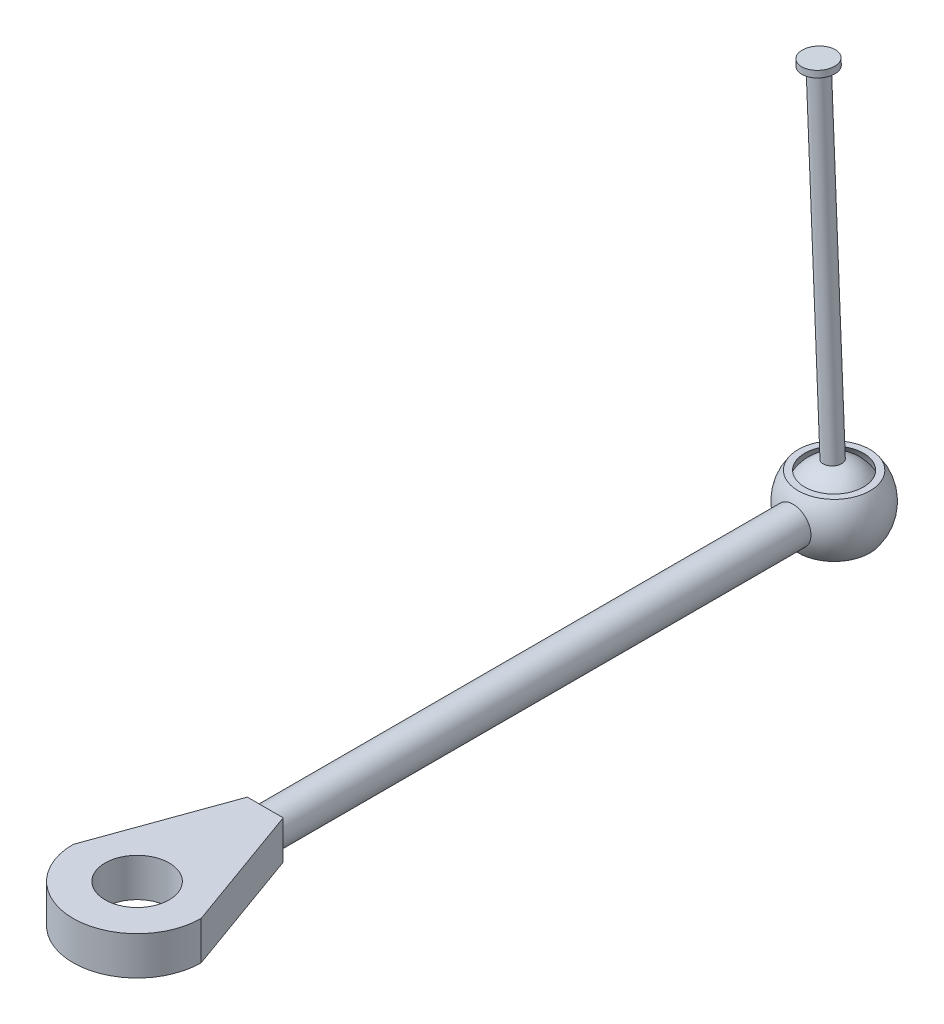
ISO-10303-21;
HEADER;
FILE_DESCRIPTION(('STEP AP214'),'2;1');
FILE_NAME('part.step','',(''),(''),'','','');
FILE_SCHEMA(('AUTOMOTIVE_DESIGN { 1 0 10303 214 1 1 1 1 }'));
ENDSEC;
DATA;
#1=APPLICATION_CONTEXT('core data for automotive mechanical design processes');
#2=APPLICATION_PROTOCOL_DEFINITION('international standard','automotive_design',2000,#1);
#3=PRODUCT_CONTEXT('',#1,'mechanical');
#4=PRODUCT('Part','Part','',(#3));
#5=PRODUCT_RELATED_PRODUCT_CATEGORY('part','',(#4));
#6=PRODUCT_DEFINITION_FORMATION('','',#4);
#7=PRODUCT_DEFINITION_CONTEXT('part definition',#1,'design');
#8=PRODUCT_DEFINITION('design','',#6,#7);
#9=PRODUCT_DEFINITION_SHAPE('','',#8);
#10=(LENGTH_UNIT() NAMED_UNIT(*) SI_UNIT(.MILLI.,.METRE.));
#11=(NAMED_UNIT(*) PLANE_ANGLE_UNIT() SI_UNIT($,.RADIAN.));
#12=(NAMED_UNIT(*) SI_UNIT($,.STERADIAN.) SOLID_ANGLE_UNIT());
#13=UNCERTAINTY_MEASURE_WITH_UNIT(LENGTH_MEASURE(1.E-05),#10,'distance_accuracy_value','');
#14=(GEOMETRIC_REPRESENTATION_CONTEXT(3) GLOBAL_UNCERTAINTY_ASSIGNED_CONTEXT((#13)) GLOBAL_UNIT_ASSIGNED_CONTEXT((#10,
#11,#12)) REPRESENTATION_CONTEXT('',''));
#15=CARTESIAN_POINT('',(0.,0.,0.));
#16=DIRECTION('',(0.,0.,1.));
#17=DIRECTION('',(1.,0.,0.));
#18=AXIS2_PLACEMENT_3D('',#15,#16,#17);
#19=CARTESIAN_POINT('',(-2.292,-2.1,0.));
#20=DIRECTION('',(0.,1.,0.));
#21=DIRECTION('',(0.,0.,1.));
#22=AXIS2_PLACEMENT_3D('',#19,#20,#21);
#23=PLANE('',#22);
#24=CARTESIAN_POINT('',(0.,-2.1,0.));
#25=DIRECTION('',(0.,1.,0.));
#26=DIRECTION('',(0.,0.,1.));
#27=AXIS2_PLACEMENT_3D('',#24,#25,#26);
#28=CIRCLE('',#27,2.8);
#29=CARTESIAN_POINT('',(0.,-2.1,2.8));
#30=VERTEX_POINT('',#29);
#31=EDGE_CURVE('P0_E34',#30,#30,#28,.T.);
#32=ORIENTED_EDGE('',*,*,#31,.F.);
#33=EDGE_LOOP('',(#32));
#34=FACE_BOUND('',#33,.T.);
#35=CARTESIAN_POINT('',(0.,-2.1,0.));
#36=DIRECTION('',(0.,1.,0.));
#37=DIRECTION('',(0.,0.,1.));
#38=AXIS2_PLACEMENT_3D('',#35,#36,#37);
#39=CIRCLE('',#38,2.292);
#40=CARTESIAN_POINT('',(0.,-2.1,2.292));
#41=VERTEX_POINT('',#40);
#42=EDGE_CURVE('P0_E21',#41,#41,#39,.T.);
#43=ORIENTED_EDGE('',*,*,#42,.T.);
#44=EDGE_LOOP('',(#43));
#45=FACE_BOUND('',#44,.T.);
#46=ADVANCED_FACE('P0_F15',(#34,#45),#23,.F.);
#47=CARTESIAN_POINT('',(0.,0.,0.));
#48=DIRECTION('',(0.,1.,0.));
#49=DIRECTION('',(0.,0.,1.));
#50=AXIS2_PLACEMENT_3D('',#47,#48,#49);
#51=DEGENERATE_TOROIDAL_SURFACE('',#50,0.508,3.5,.F.);
#52=ORIENTED_EDGE('',*,*,#42,.F.);
#53=EDGE_LOOP('',(#52));
#54=FACE_BOUND('',#53,.T.);
#55=CARTESIAN_POINT('',(0.,2.1,0.));
#56=DIRECTION('',(0.,1.,0.));
#57=DIRECTION('',(0.,0.,1.));
#58=AXIS2_PLACEMENT_3D('',#55,#56,#57);
#59=CIRCLE('',#58,2.292);
#60=CARTESIAN_POINT('',(0.,2.1,2.292));
#61=VERTEX_POINT('',#60);
#62=EDGE_CURVE('P0_E25',#61,#61,#59,.T.);
#63=ORIENTED_EDGE('',*,*,#62,.T.);
#64=EDGE_LOOP('',(#63));
#65=FACE_BOUND('',#64,.T.);
#66=ADVANCED_FACE('P0_F57',(#54,#65),#51,.T.);
#67=CARTESIAN_POINT('',(-2.8,2.1,0.));
#68=DIRECTION('',(0.,-1.,0.));
#69=DIRECTION('',(0.,0.,-1.));
#70=AXIS2_PLACEMENT_3D('',#67,#68,#69);
#71=PLANE('',#70);
#72=ORIENTED_EDGE('',*,*,#62,.F.);
#73=EDGE_LOOP('',(#72));
#74=FACE_BOUND('',#73,.T.);
#75=CARTESIAN_POINT('',(0.,2.1,0.));
#76=DIRECTION('',(0.,1.,0.));
#77=DIRECTION('',(0.,0.,1.));
#78=AXIS2_PLACEMENT_3D('',#75,#76,#77);
#79=CIRCLE('',#78,2.8);
#80=CARTESIAN_POINT('',(0.,2.1,2.8));
#81=VERTEX_POINT('',#80);
#82=EDGE_CURVE('P0_E29',#81,#81,#79,.T.);
#83=ORIENTED_EDGE('',*,*,#82,.T.);
#84=EDGE_LOOP('',(#83));
#85=FACE_BOUND('',#84,.T.);
#86=ADVANCED_FACE('P0_F53',(#74,#85),#71,.F.);
#87=CARTESIAN_POINT('',(0.,0.,0.));
#88=DIRECTION('',(0.,1.,0.));
#89=DIRECTION('',(-1.,0.,0.));
#90=AXIS2_PLACEMENT_3D('',#87,#88,#89);
#91=SPHERICAL_SURFACE('',#90,3.5);
#92=CARTESIAN_POINT('',(0.,0.,3.20780298646909));
#93=DIRECTION('',(0.,0.,-1.));
#94=DIRECTION('',(-1.,0.,0.));
#95=AXIS2_PLACEMENT_3D('',#92,#93,#94);
#96=CIRCLE('',#95,1.4);
#97=CARTESIAN_POINT('',(-1.4,0.,3.20780298646909));
#98=VERTEX_POINT('',#97);
#99=EDGE_CURVE('P0_E10',#98,#98,#96,.F.);
#100=ORIENTED_EDGE('',*,*,#99,.F.);
#101=EDGE_LOOP('',(#100));
#102=FACE_BOUND('',#101,.T.);
#103=ORIENTED_EDGE('',*,*,#31,.T.);
#104=EDGE_LOOP('',(#103));
#105=FACE_BOUND('',#104,.T.);
#106=ORIENTED_EDGE('',*,*,#82,.F.);
#107=EDGE_LOOP('',(#106));
#108=FACE_BOUND('',#107,.T.);
#109=ADVANCED_FACE('P0_F45',(#102,#105,#108),#91,.T.);
#110=CARTESIAN_POINT('',(0.,0.,-3.501));
#111=DIRECTION('',(0.,0.,1.));
#112=DIRECTION('',(1.,0.,0.));
#113=AXIS2_PLACEMENT_3D('',#110,#111,#112);
#114=CYLINDRICAL_SURFACE('',#113,1.4);
#115=ORIENTED_EDGE('',*,*,#99,.T.);
#116=EDGE_LOOP('',(#115));
#117=FACE_BOUND('',#116,.T.);
#118=CARTESIAN_POINT('',(0.,0.,44.4));
#119=DIRECTION('',(0.,0.,1.));
#120=DIRECTION('',(1.,0.,0.));
#121=AXIS2_PLACEMENT_3D('',#118,#119,#120);
#122=CIRCLE('',#121,1.4);
#123=CARTESIAN_POINT('',(1.4,0.,44.4));
#124=VERTEX_POINT('',#123);
#125=EDGE_CURVE('P0_E37',#124,#124,#122,.T.);
#126=ORIENTED_EDGE('',*,*,#125,.F.);
#127=EDGE_LOOP('',(#126));
#128=FACE_BOUND('',#127,.T.);
#129=ADVANCED_FACE('P0_F43',(#117,#128),#114,.T.);
#130=CARTESIAN_POINT('',(0.,0.,44.4));
#131=DIRECTION('',(0.,0.,1.));
#132=DIRECTION('',(1.,0.,0.));
#133=AXIS2_PLACEMENT_3D('',#130,#131,#132);
#134=PLANE('',#133);
#135=ORIENTED_EDGE('',*,*,#125,.T.);
#136=EDGE_LOOP('',(#135));
#137=FACE_BOUND('',#136,.T.);
#138=ADVANCED_FACE('P0_F41',(#137),#134,.T.);
#139=CLOSED_SHELL('',(#46,#66,#86,#109,#129,#138));
#140=MANIFOLD_SOLID_BREP('P0_B1',#139);
#141=CARTESIAN_POINT('',(0.,0.,0.));
#142=DIRECTION('',(-0.0552914491738899,0.998385219503145,-0.0130310830673763));
#143=DIRECTION('',(0.956943459801966,0.0492626198663518,-0.28606364506198));
#144=AXIS2_PLACEMENT_3D('',#141,#142,#143);
#145=SPHERICAL_SURFACE('',#144,2.83772600090261);
#146=CARTESIAN_POINT('',(-0.152053383785965,2.74559363546279,-0.0358359258871848));
#147=DIRECTION('',(0.0552914491738899,-0.998385219503144,0.0130310830673763));
#148=DIRECTION('',(0.28495976977548,0.0282868832069041,0.958122007808997));
#149=AXIS2_PLACEMENT_3D('',#146,#147,#148);
#150=CIRCLE('',#149,0.7);
#151=CARTESIAN_POINT('',(0.0474184550568713,2.76539445370762,0.634849479579113));
#152=VERTEX_POINT('',#151);
#153=EDGE_CURVE('P1_E10',#152,#152,#150,.F.);
#154=ORIENTED_EDGE('',*,*,#153,.F.);
#155=EDGE_LOOP('',(#154));
#156=FACE_BOUND('',#155,.T.);
#157=ADVANCED_FACE('P1_F16',(#156),#145,.T.);
#158=CARTESIAN_POINT('',(-1.57580630145586,28.4539787558396,-0.371385867420226));
#159=DIRECTION('',(0.0552914491738899,-0.998385219503144,0.0130310830673763));
#160=DIRECTION('',(0.28495976977548,0.0282868832069041,0.958122007808997));
#161=AXIS2_PLACEMENT_3D('',#158,#159,#160);
#162=CYLINDRICAL_SURFACE('',#161,0.7);
#163=CARTESIAN_POINT('',(-1.57580630145586,28.4539787558396,-0.371385867420226));
#164=DIRECTION('',(-0.0552914491738899,0.998385219503145,-0.0130310830673763));
#165=DIRECTION('',(-0.28495976977548,-0.0282868832069041,-0.958122007808997));
#166=AXIS2_PLACEMENT_3D('',#163,#164,#165);
#167=CIRCLE('',#166,0.7);
#168=CARTESIAN_POINT('',(-1.37633446261303,28.4737795740844,0.299299538046073));
#169=VERTEX_POINT('',#168);
#170=EDGE_CURVE('P1_E27',#169,#169,#167,.T.);
#171=CARTESIAN_POINT('',(-1.37633446261303,28.4737795740844,0.299299538046073));
#172=CARTESIAN_POINT('',(-1.36150370305396,28.2059838957472,0.302794849937042));
#173=CARTESIAN_POINT('',(-1.3466729434949,27.9381882174099,0.306290161828011));
#174=CARTESIAN_POINT('',(-1.31701142437678,27.4025968607354,0.313280785609949));
#175=CARTESIAN_POINT('',(-1.30218066481772,27.1348011823982,0.316776097500918));
#176=CARTESIAN_POINT('',(-1.2725191456996,26.5992098257236,0.323766721282857));
#177=CARTESIAN_POINT('',(-1.25768838614053,26.3314141473864,0.327262033173826));
#178=CARTESIAN_POINT('',(-1.22802686702241,25.7958227907119,0.334252656955764));
#179=CARTESIAN_POINT('',(-1.21319610746335,25.5280271123746,0.337747968846734));
#180=CARTESIAN_POINT('',(-1.18353458834523,24.9924357557001,0.344738592628672));
#181=CARTESIAN_POINT('',(-1.16870382878617,24.7246400773628,0.348233904519641));
#182=CARTESIAN_POINT('',(-1.13904230966804,24.1890487206883,0.355224528301579));
#183=CARTESIAN_POINT('',(-1.12421155010898,23.9212530423511,0.358719840192549));
#184=CARTESIAN_POINT('',(-1.09455003099086,23.3856616856765,0.365710463974487));
#185=CARTESIAN_POINT('',(-1.0797192714318,23.1178660073393,0.369205775865456));
#186=CARTESIAN_POINT('',(-1.05005775231367,22.5822746506648,0.376196399647394));
#187=CARTESIAN_POINT('',(-1.03522699275461,22.3144789723275,0.379691711538364));
#188=CARTESIAN_POINT('',(-1.00556547363649,21.778887615653,0.386682335320302));
#189=CARTESIAN_POINT('',(-0.990734714077429,21.5110919373157,0.390177647211271));
#190=CARTESIAN_POINT('',(-0.961073194959306,20.9755005806412,0.397168270993209));
#191=CARTESIAN_POINT('',(-0.946242435400244,20.707704902304,0.400663582884179));
#192=CARTESIAN_POINT('',(-0.916580916282122,20.1721135456294,0.407654206666117));
#193=CARTESIAN_POINT('',(-0.90175015672306,19.9043178672922,0.411149518557086));
#194=CARTESIAN_POINT('',(-0.872088637604937,19.3687265106177,0.418140142339025));
#195=CARTESIAN_POINT('',(-0.857257878045876,19.1009308322804,0.421635454229994));
#196=CARTESIAN_POINT('',(-0.827596358927753,18.5653394756059,0.428626078011932));
#197=CARTESIAN_POINT('',(-0.812765599368692,18.2975437972686,0.432121389902901));
#198=CARTESIAN_POINT('',(-0.783104080250569,17.7619524405941,0.43911201368484));
#199=CARTESIAN_POINT('',(-0.768273320691507,17.4941567622568,0.442607325575809));
#200=CARTESIAN_POINT('',(-0.738611801573384,16.9585654055823,0.449597949357747));
#201=CARTESIAN_POINT('',(-0.723781042014323,16.6907697272451,0.453093261248716));
#202=CARTESIAN_POINT('',(-0.6941195228962,16.1551783705706,0.460083885030655));
#203=CARTESIAN_POINT('',(-0.679288763337139,15.8873826922333,0.463579196921624));
#204=CARTESIAN_POINT('',(-0.649627244219016,15.3517913355588,0.470569820703562));
#205=CARTESIAN_POINT('',(-0.634796484659955,15.0839956572215,0.474065132594531));
#206=CARTESIAN_POINT('',(-0.605134965541832,14.548404300547,0.48105575637647));
#207=CARTESIAN_POINT('',(-0.59030420598277,14.2806086222097,0.484551068267439));
#208=CARTESIAN_POINT('',(-0.560642686864647,13.7450172655352,0.491541692049377));
#209=CARTESIAN_POINT('',(-0.545811927305586,13.477221587198,0.495037003940346));
#210=CARTESIAN_POINT('',(-0.516150408187463,12.9416302305235,0.502027627722285));
#211=CARTESIAN_POINT('',(-0.501319648628401,12.6738345521862,0.505522939613254));
#212=CARTESIAN_POINT('',(-0.471658129510278,12.1382431955117,0.512513563395192));
#213=CARTESIAN_POINT('',(-0.456827369951217,11.8704475171744,0.516008875286161));
#214=CARTESIAN_POINT('',(-0.427165850833094,11.3348561604999,0.5229994990681));
#215=CARTESIAN_POINT('',(-0.412335091274033,11.0670604821626,0.526494810959069));
#216=CARTESIAN_POINT('',(-0.38267357215591,10.5314691254881,0.533485434741007));
#217=CARTESIAN_POINT('',(-0.367842812596849,10.2636734471509,0.536980746631976));
#218=CARTESIAN_POINT('',(-0.338181293478726,9.72808209047634,0.543971370413915));
#219=CARTESIAN_POINT('',(-0.323350533919664,9.46028641213909,0.547466682304884));
#220=CARTESIAN_POINT('',(-0.293689014801541,8.92469505546457,0.554457306086822));
#221=CARTESIAN_POINT('',(-0.27885825524248,8.65689937712731,0.557952617977792));
#222=CARTESIAN_POINT('',(-0.249196736124357,8.12130802045279,0.56494324175973));
#223=CARTESIAN_POINT('',(-0.234365976565296,7.85351234211553,0.568438553650699));
#224=CARTESIAN_POINT('',(-0.204704457447173,7.31792098544102,0.575429177432637));
#225=CARTESIAN_POINT('',(-0.189873697888112,7.05012530710376,0.578924489323607));
#226=CARTESIAN_POINT('',(-0.160212178769989,6.51453395042924,0.585915113105545));
#227=CARTESIAN_POINT('',(-0.145381419210927,6.24673827209198,0.589410424996514));
#228=CARTESIAN_POINT('',(-0.115719900092804,5.71114691541746,0.596401048778452));
#229=CARTESIAN_POINT('',(-0.100889140533743,5.44335123708021,0.599896360669422));
#230=CARTESIAN_POINT('',(-0.07122762141562,4.90775988040569,0.60688698445136));
#231=CARTESIAN_POINT('',(-0.0563968618565585,4.63996420206843,0.610382296342329));
#232=CARTESIAN_POINT('',(-0.0267353427384357,4.10437284539391,0.617372920124267));
#233=CARTESIAN_POINT('',(-0.0119045831793744,3.83657716705665,0.620868232015237));
#234=CARTESIAN_POINT('',(0.0177569359387483,3.30098581038214,0.627858855797175));
#235=CARTESIAN_POINT('',(0.0325876954978097,3.03319013204488,0.631354167688144));
#236=CARTESIAN_POINT('',(0.0474184550568713,2.76539445370762,0.634849479579113));
#237=B_SPLINE_CURVE_WITH_KNOTS('',3,(#171,#172,#173,#174,#175,#176,#177,#178,#179,#180,#181,
#182,#183,#184,#185,#186,#187,#188,#189,#190,#191,#192,#193,#194,#195,#196,#197,#198,#199,#200,
#201,#202,#203,#204,#205,#206,#207,#208,#209,#210,#211,#212,#213,#214,#215,#216,#217,#218,#219,
#220,#221,#222,#223,#224,#225,#226,#227,#228,#229,#230,#231,#232,#233,#234,#235,#236),
.UNSPECIFIED.,.F.,.F.,(4,2,2,2,2,2,2,2,2,2,2,2,2,2,2,2,2,2,2,2,2,2,2,2,2,2,2,2,2,2,2,2,4),(0.,
0.804686426960113,1.60937285392023,2.41405928088034,3.21874570784046,4.02343213480057,
4.82811856176069,5.63280498872081,6.43749141568092,7.24217784264104,8.04686426960116,
8.85155069656127,9.65623712352139,10.4609235504815,11.2656099774416,12.0702964044017,
12.8749828313618,13.679669258322,14.4843556852821,15.2890421122422,16.0937285392023,
16.8984149661624,17.7031013931225,18.5077878200827,19.3124742470428,20.1171606740029,
20.921847100963,21.7265335279231,22.5312199548832,23.3359063818433,24.1405928088035,
24.9452792357636,25.7499656627237),.UNSPECIFIED.);
#238=EDGE_CURVE('P1_BSEAM46',#169,#152,#237,.T.);
#239=ORIENTED_EDGE('',*,*,#170,.F.);
#240=ORIENTED_EDGE('',*,*,#153,.T.);
#241=ORIENTED_EDGE('',*,*,#238,.T.);
#242=ORIENTED_EDGE('',*,*,#238,.F.);
#243=EDGE_LOOP('',(#239,#241,#240,#242));
#244=FACE_BOUND('',#243,.T.);
#245=ADVANCED_FACE('P1_F46',(#244),#162,.T.);
#246=CARTESIAN_POINT('',(-1.60345202604281,28.9531713655912,-0.377901408953914));
#247=DIRECTION('',(0.0552914491738899,-0.998385219503145,0.0130310830673763));
#248=DIRECTION('',(0.28495976977548,0.0282868832069041,0.958122007808997));
#249=AXIS2_PLACEMENT_3D('',#246,#247,#248);
#250=CYLINDRICAL_SURFACE('',#249,1.25);
#251=CARTESIAN_POINT('',(-1.60345202604281,28.9531713655912,-0.377901408953914));
#252=DIRECTION('',(-0.0552914491738899,0.998385219503145,-0.0130310830673763));
#253=DIRECTION('',(-0.28495976977548,-0.0282868832069041,-0.958122007808997));
#254=AXIS2_PLACEMENT_3D('',#251,#252,#253);
#255=CIRCLE('',#254,1.25);
#256=CARTESIAN_POINT('',(-1.24725231382346,28.9885299695998,0.819751100807333));
#257=VERTEX_POINT('',#256);
#258=EDGE_CURVE('P1_E32',#257,#257,#255,.T.);
#259=CARTESIAN_POINT('',(-1.57580630145586,28.4539787558396,-0.371385867420226));
#260=DIRECTION('',(-0.0552914491738899,0.998385219503145,-0.0130310830673763));
#261=DIRECTION('',(-0.28495976977548,-0.0282868832069041,-0.958122007808997));
#262=AXIS2_PLACEMENT_3D('',#259,#260,#261);
#263=CIRCLE('',#262,1.25);
#264=CARTESIAN_POINT('',(-1.21960658923651,28.4893373598483,0.826266642341021));
#265=VERTEX_POINT('',#264);
#266=EDGE_CURVE('P1_E35',#265,#265,#263,.T.);
#267=CARTESIAN_POINT('',(-1.24725231382346,28.9885299695998,0.819751100807333));
#268=CARTESIAN_POINT('',(-1.24696433752568,28.9833300465816,0.819818971031642));
#269=CARTESIAN_POINT('',(-1.2466763612279,28.9781301235633,0.819886841255952));
#270=CARTESIAN_POINT('',(-1.24610040863233,28.9677302775268,0.82002258170457));
#271=CARTESIAN_POINT('',(-1.24581243233455,28.9625303545086,0.820090451928879));
#272=CARTESIAN_POINT('',(-1.24523647973899,28.9521305084721,0.820226192377498));
#273=CARTESIAN_POINT('',(-1.24494850344121,28.9469305854539,0.820294062601807));
#274=CARTESIAN_POINT('',(-1.24437255084565,28.9365307394174,0.820429803050426));
#275=CARTESIAN_POINT('',(-1.24408457454787,28.9313308163991,0.820497673274735));
#276=CARTESIAN_POINT('',(-1.24350862195231,28.9209309703626,0.820633413723353));
#277=CARTESIAN_POINT('',(-1.24322064565453,28.9157310473444,0.820701283947663));
#278=CARTESIAN_POINT('',(-1.24264469305897,28.9053312013079,0.820837024396281));
#279=CARTESIAN_POINT('',(-1.24235671676119,28.9001312782896,0.82090489462059));
#280=CARTESIAN_POINT('',(-1.24178076416562,28.8897314322532,0.821040635069209));
#281=CARTESIAN_POINT('',(-1.24149278786784,28.8845315092349,0.821108505293518));
#282=CARTESIAN_POINT('',(-1.24091683527228,28.8741316631984,0.821244245742137));
#283=CARTESIAN_POINT('',(-1.2406288589745,28.8689317401802,0.821312115966446));
#284=CARTESIAN_POINT('',(-1.24005290637894,28.8585318941437,0.821447856415064));
#285=CARTESIAN_POINT('',(-1.23976493008116,28.8533319711254,0.821515726639374));
#286=CARTESIAN_POINT('',(-1.2391889774856,28.8429321250889,0.821651467087992));
#287=CARTESIAN_POINT('',(-1.23890100118782,28.8377322020707,0.821719337312301));
#288=CARTESIAN_POINT('',(-1.23832504859226,28.8273323560342,0.82185507776092));
#289=CARTESIAN_POINT('',(-1.23803707229448,28.822132433016,0.821922947985229));
#290=CARTESIAN_POINT('',(-1.23746111969891,28.8117325869795,0.822058688433848));
#291=CARTESIAN_POINT('',(-1.23717314340113,28.8065326639612,0.822126558658157));
#292=CARTESIAN_POINT('',(-1.23659719080557,28.7961328179247,0.822262299106775));
#293=CARTESIAN_POINT('',(-1.23630921450779,28.7909328949065,0.822330169331085));
#294=CARTESIAN_POINT('',(-1.23573326191223,28.78053304887,0.822465909779703));
#295=CARTESIAN_POINT('',(-1.23544528561445,28.7753331258518,0.822533780004012));
#296=CARTESIAN_POINT('',(-1.23486933301889,28.7649332798153,0.822669520452631));
#297=CARTESIAN_POINT('',(-1.23458135672111,28.759733356797,0.82273739067694));
#298=CARTESIAN_POINT('',(-1.23400540412555,28.7493335107605,0.822873131125559));
#299=CARTESIAN_POINT('',(-1.23371742782777,28.7441335877423,0.822941001349868));
#300=CARTESIAN_POINT('',(-1.2331414752322,28.7337337417058,0.823076741798486));
#301=CARTESIAN_POINT('',(-1.23285349893442,28.7285338186875,0.823144612022796));
#302=CARTESIAN_POINT('',(-1.23227754633886,28.7181339726511,0.823280352471414));
#303=CARTESIAN_POINT('',(-1.23198957004108,28.7129340496328,0.823348222695723));
#304=CARTESIAN_POINT('',(-1.23141361744552,28.7025342035963,0.823483963144342));
#305=CARTESIAN_POINT('',(-1.23112564114774,28.6973342805781,0.823551833368651));
#306=CARTESIAN_POINT('',(-1.23054968855218,28.6869344345416,0.82368757381727));
#307=CARTESIAN_POINT('',(-1.2302617122544,28.6817345115233,0.823755444041579));
#308=CARTESIAN_POINT('',(-1.22968575965884,28.6713346654868,0.823891184490197));
#309=CARTESIAN_POINT('',(-1.22939778336105,28.6661347424686,0.823959054714507));
#310=CARTESIAN_POINT('',(-1.22882183076549,28.6557348964321,0.824094795163125));
#311=CARTESIAN_POINT('',(-1.22853385446771,28.6505349734139,0.824162665387434));
#312=CARTESIAN_POINT('',(-1.22795790187215,28.6401351273774,0.824298405836053));
#313=CARTESIAN_POINT('',(-1.22766992557437,28.6349352043591,0.824366276060362));
#314=CARTESIAN_POINT('',(-1.22709397297881,28.6245353583226,0.824502016508981));
#315=CARTESIAN_POINT('',(-1.22680599668103,28.6193354353044,0.82456988673329));
#316=CARTESIAN_POINT('',(-1.22623004408547,28.6089355892679,0.824705627181908));
#317=CARTESIAN_POINT('',(-1.22594206778769,28.6037356662497,0.824773497406218));
#318=CARTESIAN_POINT('',(-1.22536611519213,28.5933358202132,0.824909237854836));
#319=CARTESIAN_POINT('',(-1.22507813889434,28.5881358971949,0.824977108079145));
#320=CARTESIAN_POINT('',(-1.22450218629878,28.5777360511584,0.825112848527764));
#321=CARTESIAN_POINT('',(-1.224214210001,28.5725361281402,0.825180718752073));
#322=CARTESIAN_POINT('',(-1.22363825740544,28.5621362821037,0.825316459200692));
#323=CARTESIAN_POINT('',(-1.22335028110766,28.5569363590854,0.825384329425001));
#324=CARTESIAN_POINT('',(-1.2227743285121,28.546536513049,0.825520069873619));
#325=CARTESIAN_POINT('',(-1.22248635221432,28.5413365900307,0.825587940097929));
#326=CARTESIAN_POINT('',(-1.22191039961876,28.5309367439942,0.825723680546547));
#327=CARTESIAN_POINT('',(-1.22162242332098,28.525736820976,0.825791550770856));
#328=CARTESIAN_POINT('',(-1.22104647072542,28.5153369749395,0.825927291219475));
#329=CARTESIAN_POINT('',(-1.22075849442763,28.5101370519212,0.825995161443784));
#330=CARTESIAN_POINT('',(-1.22018254183207,28.4997372058847,0.826130901892403));
#331=CARTESIAN_POINT('',(-1.21989456553429,28.4945372828665,0.826198772116712));
#332=CARTESIAN_POINT('',(-1.21960658923651,28.4893373598483,0.826266642341021));
#333=B_SPLINE_CURVE_WITH_KNOTS('',3,(#267,#268,#269,#270,#271,#272,#273,#274,#275,#276,#277,
#278,#279,#280,#281,#282,#283,#284,#285,#286,#287,#288,#289,#290,#291,#292,#293,#294,#295,#296,
#297,#298,#299,#300,#301,#302,#303,#304,#305,#306,#307,#308,#309,#310,#311,#312,#313,#314,#315,
#316,#317,#318,#319,#320,#321,#322,#323,#324,#325,#326,#327,#328,#329,#330,#331,#332),
.UNSPECIFIED.,.F.,.F.,(4,2,2,2,2,2,2,2,2,2,2,2,2,2,2,2,2,2,2,2,2,2,2,2,2,2,2,2,2,2,2,2,4),(0.,
0.015624999999998,0.0312499999999995,0.0468749999999975,0.062499999999999,0.078124999999997,
0.0937499999999985,0.109374999999996,0.124999999999998,0.140624999999999,0.156249999999997,
0.171874999999999,0.187499999999997,0.203124999999998,0.218749999999996,0.234374999999998,
0.249999999999999,0.265624999999997,0.281249999999999,0.296874999999997,0.312499999999998,
0.328124999999996,0.343749999999998,0.359374999999996,0.374999999999997,0.390624999999999,
0.406249999999997,0.421874999999998,0.437499999999996,0.453124999999998,0.468749999999996,
0.484374999999997,0.499999999999995),.UNSPECIFIED.);
#334=EDGE_CURVE('P1_BSEAM43',#257,#265,#333,.T.);
#335=ORIENTED_EDGE('',*,*,#258,.F.);
#336=ORIENTED_EDGE('',*,*,#266,.T.);
#337=ORIENTED_EDGE('',*,*,#334,.T.);
#338=ORIENTED_EDGE('',*,*,#334,.F.);
#339=EDGE_LOOP('',(#335,#337,#336,#338));
#340=FACE_BOUND('',#339,.T.);
#341=ADVANCED_FACE('P1_F43',(#340),#250,.T.);
#342=CARTESIAN_POINT('',(-1.60345202604281,28.9531713655912,-0.377901408953914));
#343=DIRECTION('',(-0.0552914491738899,0.998385219503145,-0.0130310830673763));
#344=DIRECTION('',(-0.28495976977548,-0.0282868832069041,-0.958122007808997));
#345=AXIS2_PLACEMENT_3D('',#342,#343,#344);
#346=PLANE('',#345);
#347=ORIENTED_EDGE('',*,*,#258,.T.);
#348=EDGE_LOOP('',(#347));
#349=FACE_BOUND('',#348,.T.);
#350=ADVANCED_FACE('P1_F41',(#349),#346,.T.);
#351=CARTESIAN_POINT('',(-1.57580630145586,28.4539787558396,-0.371385867420226));
#352=DIRECTION('',(-0.0552914491738899,0.998385219503145,-0.0130310830673763));
#353=DIRECTION('',(-0.28495976977548,-0.0282868832069041,-0.958122007808997));
#354=AXIS2_PLACEMENT_3D('',#351,#352,#353);
#355=PLANE('',#354);
#356=ORIENTED_EDGE('',*,*,#170,.T.);
#357=EDGE_LOOP('',(#356));
#358=FACE_BOUND('',#357,.T.);
#359=ORIENTED_EDGE('',*,*,#266,.F.);
#360=EDGE_LOOP('',(#359));
#361=FACE_BOUND('',#360,.T.);
#362=ADVANCED_FACE('P1_F50',(#358,#361),#355,.F.);
#363=CLOSED_SHELL('',(#157,#245,#341,#350,#362));
#364=CARTESIAN_POINT('',(0.,0.,0.));
#365=DIRECTION('',(-0.0552914491738899,0.998385219503145,-0.0130310830673763));
#366=DIRECTION('',(0.956943459801966,0.0492626198663518,-0.28606364506198));
#367=AXIS2_PLACEMENT_3D('',#364,#365,#366);
#368=SPHERICAL_SURFACE('',#367,2.80972600090261);
#369=CARTESIAN_POINT('',(-0.150455340194582,2.71673812298127,-0.0354592991375565));
#370=DIRECTION('',(0.0552914491738899,-0.998385219503144,0.0130310830673763));
#371=DIRECTION('',(0.28495976977548,0.0282868832069041,0.958122007808997));
#372=AXIS2_PLACEMENT_3D('',#369,#370,#371);
#373=CIRCLE('',#372,0.7);
#374=CARTESIAN_POINT('',(0.049016498648254,2.7365389412261,0.635226106328742));
#375=VERTEX_POINT('',#374);
#376=EDGE_CURVE('P1_E19',#375,#375,#373,.F.);
#377=ORIENTED_EDGE('',*,*,#376,.T.);
#378=EDGE_LOOP('',(#377));
#379=FACE_BOUND('',#378,.T.);
#380=ADVANCED_FACE('P1_F79',(#379),#368,.F.);
#381=CARTESIAN_POINT('',(0.,0.,0.));
#382=DIRECTION('',(-0.0552914491738899,0.998385219503145,-0.0130310830673763));
#383=DIRECTION('',(-0.28495976977548,-0.0282868832069041,-0.958122007808997));
#384=AXIS2_PLACEMENT_3D('',#381,#382,#383);
#385=PLANE('',#384);
#386=CARTESIAN_POINT('',(0.,0.,0.));
#387=DIRECTION('',(-0.0552914491738899,0.998385219503145,-0.0130310830673763));
#388=DIRECTION('',(-0.28495976977548,-0.0282868832069041,-0.958122007808997));
#389=AXIS2_PLACEMENT_3D('',#386,#387,#388);
#390=CIRCLE('',#389,0.7);
#391=CARTESIAN_POINT('',(0.199471838842836,0.0198008182448334,0.670685405466298));
#392=VERTEX_POINT('',#391);
#393=EDGE_CURVE('P1_E29',#392,#392,#390,.T.);
#394=ORIENTED_EDGE('',*,*,#393,.F.);
#395=EDGE_LOOP('',(#394));
#396=FACE_BOUND('',#395,.T.);
#397=ADVANCED_FACE('P1_F73',(#396),#385,.F.);
#398=CARTESIAN_POINT('',(0.049016498648254,2.7365389412261,0.635226106328742));
#399=CARTESIAN_POINT('',(0.0505837417752809,2.70823958577838,0.635595474028091));
#400=CARTESIAN_POINT('',(0.0521509849023078,2.67994023033066,0.635964841727441));
#401=CARTESIAN_POINT('',(0.0552854711563616,2.62334151943522,0.63670357712614));
#402=CARTESIAN_POINT('',(0.0568527142833885,2.5950421639875,0.637072944825489));
#403=CARTESIAN_POINT('',(0.0599872005374423,2.53844345309205,0.637811680224188));
#404=CARTESIAN_POINT('',(0.0615544436644693,2.51014409764433,0.638181047923538));
#405=CARTESIAN_POINT('',(0.0646889299185232,2.45354538674889,0.638919783322237));
#406=CARTESIAN_POINT('',(0.0662561730455501,2.42524603130117,0.639289151021587));
#407=CARTESIAN_POINT('',(0.0693906592996038,2.36864732040573,0.640027886420286));
#408=CARTESIAN_POINT('',(0.0709579024266305,2.340347964958,0.640397254119635));
#409=CARTESIAN_POINT('',(0.0740923886806843,2.28374925406256,0.641135989518334));
#410=CARTESIAN_POINT('',(0.0756596318077113,2.25544989861484,0.641505357217684));
#411=CARTESIAN_POINT('',(0.0787941180617652,2.1988511877194,0.642244092616383));
#412=CARTESIAN_POINT('',(0.0803613611887921,2.17055183227167,0.642613460315733));
#413=CARTESIAN_POINT('',(0.0834958474428459,2.11395312137623,0.643352195714432));
#414=CARTESIAN_POINT('',(0.0850630905698727,2.08565376592851,0.643721563413781));
#415=CARTESIAN_POINT('',(0.0881975768239265,2.02905505503306,0.64446029881248));
#416=CARTESIAN_POINT('',(0.0897648199509534,2.00075569958534,0.64482966651183));
#417=CARTESIAN_POINT('',(0.0928993062050072,1.9441569886899,0.645568401910529));
#418=CARTESIAN_POINT('',(0.0944665493320339,1.91585763324218,0.645937769609878));
#419=CARTESIAN_POINT('',(0.0976010355860877,1.85925892234674,0.646676505008578));
#420=CARTESIAN_POINT('',(0.0991682787131147,1.83095956689901,0.647045872707927));
#421=CARTESIAN_POINT('',(0.102302764967169,1.77436085600357,0.647784608106626));
#422=CARTESIAN_POINT('',(0.103870008094195,1.74606150055585,0.648153975805976));
#423=CARTESIAN_POINT('',(0.107004494348249,1.68946278966041,0.648892711204675));
#424=CARTESIAN_POINT('',(0.108571737475276,1.66116343421269,0.649262078904024));
#425=CARTESIAN_POINT('',(0.11170622372933,1.60456472331724,0.650000814302723));
#426=CARTESIAN_POINT('',(0.113273466856357,1.57626536786952,0.650370182002073));
#427=CARTESIAN_POINT('',(0.116407953110411,1.51966665697408,0.651108917400772));
#428=CARTESIAN_POINT('',(0.117975196237437,1.49136730152636,0.651478285100122));
#429=CARTESIAN_POINT('',(0.121109682491491,1.43476859063091,0.652217020498821));
#430=CARTESIAN_POINT('',(0.122676925618518,1.40646923518319,0.65258638819817));
#431=CARTESIAN_POINT('',(0.125811411872572,1.34987052428775,0.653325123596869));
#432=CARTESIAN_POINT('',(0.127378654999599,1.32157116884003,0.653694491296219));
#433=CARTESIAN_POINT('',(0.130513141253653,1.26497245794459,0.654433226694918));
#434=CARTESIAN_POINT('',(0.13208038438068,1.23667310249686,0.654802594394268));
#435=CARTESIAN_POINT('',(0.135214870634733,1.18007439160142,0.655541329792967));
#436=CARTESIAN_POINT('',(0.13678211376176,1.1517750361537,0.655910697492316));
#437=CARTESIAN_POINT('',(0.139916600015814,1.09517632525825,0.656649432891015));
#438=CARTESIAN_POINT('',(0.141483843142841,1.06687696981053,0.657018800590365));
#439=CARTESIAN_POINT('',(0.144618329396895,1.01027825891509,0.657757535989064));
#440=CARTESIAN_POINT('',(0.146185572523921,0.981978903467367,0.658126903688413));
#441=CARTESIAN_POINT('',(0.149320058777975,0.925380192571924,0.658865639087113));
#442=CARTESIAN_POINT('',(0.150887301905002,0.897080837124201,0.659235006786462));
#443=CARTESIAN_POINT('',(0.154021788159056,0.840482126228758,0.659973742185161));
#444=CARTESIAN_POINT('',(0.155589031286083,0.812182770781037,0.660343109884511));
#445=CARTESIAN_POINT('',(0.158723517540137,0.755584059885594,0.66108184528321));
#446=CARTESIAN_POINT('',(0.160290760667164,0.727284704437873,0.661451212982559));
#447=CARTESIAN_POINT('',(0.163425246921217,0.670685993542431,0.662189948381258));
#448=CARTESIAN_POINT('',(0.164992490048244,0.64238663809471,0.662559316080608));
#449=CARTESIAN_POINT('',(0.168126976302298,0.585787927199267,0.663298051479307));
#450=CARTESIAN_POINT('',(0.169694219429325,0.557488571751546,0.663667419178657));
#451=CARTESIAN_POINT('',(0.172828705683379,0.500889860856103,0.664406154577356));
#452=CARTESIAN_POINT('',(0.174395948810406,0.47259050540838,0.664775522276705));
#453=CARTESIAN_POINT('',(0.17753043506446,0.415991794512937,0.665514257675404));
#454=CARTESIAN_POINT('',(0.179097678191486,0.387692439065216,0.665883625374754));
#455=CARTESIAN_POINT('',(0.18223216444554,0.331093728169773,0.666622360773453));
#456=CARTESIAN_POINT('',(0.183799407572567,0.302794372722052,0.666991728472803));
#457=CARTESIAN_POINT('',(0.186933893826621,0.246195661826609,0.667730463871502));
#458=CARTESIAN_POINT('',(0.188501136953648,0.217896306378886,0.668099831570851));
#459=CARTESIAN_POINT('',(0.191635623207702,0.161297595483442,0.66883856696955));
#460=CARTESIAN_POINT('',(0.193202866334728,0.132998240035719,0.6692079346689));
#461=CARTESIAN_POINT('',(0.196337352588782,0.0763995291402757,0.669946670067599));
#462=CARTESIAN_POINT('',(0.197904595715809,0.0481001736925545,0.670316037766949));
#463=CARTESIAN_POINT('',(0.199471838842836,0.0198008182448334,0.670685405466298));
#464=B_SPLINE_CURVE_WITH_KNOTS('',3,(#398,#399,#400,#401,#402,#403,#404,#405,#406,#407,#408,
#409,#410,#411,#412,#413,#414,#415,#416,#417,#418,#419,#420,#421,#422,#423,#424,#425,#426,#427,
#428,#429,#430,#431,#432,#433,#434,#435,#436,#437,#438,#439,#440,#441,#442,#443,#444,#445,#446,
#447,#448,#449,#450,#451,#452,#453,#454,#455,#456,#457,#458,#459,#460,#461,#462,#463),
.UNSPECIFIED.,.F.,.F.,(4,2,2,2,2,2,2,2,2,2,2,2,2,2,2,2,2,2,2,2,2,2,2,2,2,2,2,2,2,2,2,2,4),(0.,
0.0850353798160332,0.170070759632066,0.255106139448103,0.340141519264136,0.425176899080169,
0.510212278896206,0.595247658712239,0.680283038528276,0.765318418344309,0.850353798160342,
0.935389177976378,1.02042455779241,1.10545993760844,1.19049531742448,1.27553069724051,
1.36056607705655,1.44560145687258,1.53063683668861,1.61567221650465,1.70070759632069,
1.78574297613672,1.87077835595276,1.95581373576879,2.04084911558482,2.12588449540086,
2.21091987521689,2.29595525503293,2.38099063484896,2.46602601466499,2.55106139448103,
2.63609677429707,2.7211321541131),.UNSPECIFIED.);
#465=EDGE_CURVE('P1_BSEAM67',#375,#392,#464,.T.);
#466=ORIENTED_EDGE('',*,*,#376,.F.);
#467=ORIENTED_EDGE('',*,*,#393,.T.);
#468=ORIENTED_EDGE('',*,*,#465,.T.);
#469=ORIENTED_EDGE('',*,*,#465,.F.);
#470=EDGE_LOOP('',(#466,#468,#467,#469));
#471=FACE_BOUND('',#470,.T.);
#472=ADVANCED_FACE('P1_F67',(#471),#162,.T.);
#473=CLOSED_SHELL('',(#380,#397,#472));
#474=ORIENTED_CLOSED_SHELL('',*,#473,.T.);
#475=BREP_WITH_VOIDS('P1_B1',#363,(#474));
#476=CARTESIAN_POINT('',(0.,1.5,54.4));
#477=DIRECTION('',(0.,1.,0.));
#478=DIRECTION('',(0.,0.,1.));
#479=AXIS2_PLACEMENT_3D('',#476,#477,#478);
#480=PLANE('',#479);
#481=DIRECTION('',(-0.338719468272742,0.,0.940887411868727));
#482=VECTOR('',#481,1.);
#483=CARTESIAN_POINT('',(-1.4,1.5,44.4));
#484=LINE('',#483,#482);
#485=CARTESIAN_POINT('',(-1.4,1.5,44.4));
#486=VERTEX_POINT('',#485);
#487=CARTESIAN_POINT('',(-5.,1.5,54.4));
#488=VERTEX_POINT('',#487);
#489=EDGE_CURVE('P2_E68',#486,#488,#484,.T.);
#490=ORIENTED_EDGE('',*,*,#489,.T.);
#491=CARTESIAN_POINT('',(0.,1.5,54.4));
#492=DIRECTION('',(0.,1.,0.));
#493=DIRECTION('',(0.,0.,1.));
#494=AXIS2_PLACEMENT_3D('',#491,#492,#493);
#495=CIRCLE('',#494,5.);
#496=CARTESIAN_POINT('',(5.,1.5,54.4));
#497=VERTEX_POINT('',#496);
#498=EDGE_CURVE('P2_E63',#488,#497,#495,.T.);
#499=ORIENTED_EDGE('',*,*,#498,.T.);
#500=DIRECTION('',(-0.338719468272742,0.,-0.940887411868727));
#501=VECTOR('',#500,1.);
#502=CARTESIAN_POINT('',(1.4,1.5,44.4));
#503=LINE('',#502,#501);
#504=CARTESIAN_POINT('',(1.4,1.5,44.4));
#505=VERTEX_POINT('',#504);
#506=EDGE_CURVE('P2_E66',#497,#505,#503,.T.);
#507=ORIENTED_EDGE('',*,*,#506,.T.);
#508=DIRECTION('',(-1.,0.,0.));
#509=VECTOR('',#508,1.);
#510=CARTESIAN_POINT('',(-1.4,1.5,44.4));
#511=LINE('',#510,#509);
#512=EDGE_CURVE('P2_E33',#505,#486,#511,.T.);
#513=ORIENTED_EDGE('',*,*,#512,.T.);
#514=EDGE_LOOP('',(#490,#499,#507,#513));
#515=FACE_BOUND('',#514,.T.);
#516=CARTESIAN_POINT('',(0.,1.5,54.4));
#517=DIRECTION('',(0.,1.,0.));
#518=DIRECTION('',(0.,0.,1.));
#519=AXIS2_PLACEMENT_3D('',#516,#517,#518);
#520=CIRCLE('',#519,2.5);
#521=CARTESIAN_POINT('',(0.,1.5,56.9));
#522=VERTEX_POINT('',#521);
#523=EDGE_CURVE('P2_E83',#522,#522,#520,.T.);
#524=ORIENTED_EDGE('',*,*,#523,.F.);
#525=EDGE_LOOP('',(#524));
#526=FACE_BOUND('',#525,.T.);
#527=ADVANCED_FACE('P2_F16',(#515,#526),#480,.T.);
#528=CARTESIAN_POINT('',(0.,-1.5,54.4));
#529=DIRECTION('',(0.,1.,0.));
#530=DIRECTION('',(0.,0.,1.));
#531=AXIS2_PLACEMENT_3D('',#528,#529,#530);
#532=PLANE('',#531);
#533=DIRECTION('',(-0.338719468272742,0.,0.940887411868727));
#534=VECTOR('',#533,1.);
#535=CARTESIAN_POINT('',(-1.4,-1.5,44.4));
#536=LINE('',#535,#534);
#537=CARTESIAN_POINT('',(-1.4,-1.5,44.4));
#538=VERTEX_POINT('',#537);
#539=CARTESIAN_POINT('',(-5.,-1.5,54.4));
#540=VERTEX_POINT('',#539);
#541=EDGE_CURVE('P2_E80',#538,#540,#536,.T.);
#542=ORIENTED_EDGE('',*,*,#541,.F.);
#543=DIRECTION('',(-1.,0.,0.));
#544=VECTOR('',#543,1.);
#545=CARTESIAN_POINT('',(-1.4,-1.5,44.4));
#546=LINE('',#545,#544);
#547=CARTESIAN_POINT('',(1.4,-1.5,44.4));
#548=VERTEX_POINT('',#547);
#549=EDGE_CURVE('P2_E56',#548,#538,#546,.T.);
#550=ORIENTED_EDGE('',*,*,#549,.F.);
#551=DIRECTION('',(-0.338719468272742,0.,-0.940887411868727));
#552=VECTOR('',#551,1.);
#553=CARTESIAN_POINT('',(1.4,-1.5,44.4));
#554=LINE('',#553,#552);
#555=CARTESIAN_POINT('',(5.,-1.5,54.4));
#556=VERTEX_POINT('',#555);
#557=EDGE_CURVE('P2_E50',#556,#548,#554,.T.);
#558=ORIENTED_EDGE('',*,*,#557,.F.);
#559=CARTESIAN_POINT('',(0.,-1.5,54.4));
#560=DIRECTION('',(0.,1.,0.));
#561=DIRECTION('',(0.,0.,1.));
#562=AXIS2_PLACEMENT_3D('',#559,#560,#561);
#563=CIRCLE('',#562,5.);
#564=EDGE_CURVE('P2_E72',#540,#556,#563,.T.);
#565=ORIENTED_EDGE('',*,*,#564,.F.);
#566=EDGE_LOOP('',(#542,#550,#558,#565));
#567=FACE_BOUND('',#566,.T.);
#568=CARTESIAN_POINT('',(0.,-1.5,54.4));
#569=DIRECTION('',(0.,1.,0.));
#570=DIRECTION('',(0.,0.,1.));
#571=AXIS2_PLACEMENT_3D('',#568,#569,#570);
#572=CIRCLE('',#571,2.5);
#573=CARTESIAN_POINT('',(0.,-1.5,56.9));
#574=VERTEX_POINT('',#573);
#575=EDGE_CURVE('P2_E95',#574,#574,#572,.T.);
#576=ORIENTED_EDGE('',*,*,#575,.T.);
#577=EDGE_LOOP('',(#576));
#578=FACE_BOUND('',#577,.T.);
#579=ADVANCED_FACE('P2_F91',(#567,#578),#532,.F.);
#580=CARTESIAN_POINT('',(-1.4,1.5,44.4));
#581=DIRECTION('',(0.940887411868727,0.,0.338719468272742));
#582=DIRECTION('',(0.338719468272742,0.,-0.940887411868727));
#583=AXIS2_PLACEMENT_3D('',#580,#581,#582);
#584=PLANE('',#583);
#585=ORIENTED_EDGE('',*,*,#541,.T.);
#586=DIRECTION('',(0.,-1.,0.));
#587=VECTOR('',#586,1.);
#588=CARTESIAN_POINT('',(-5.,1.5,54.4));
#589=LINE('',#588,#587);
#590=EDGE_CURVE('P2_E10',#488,#540,#589,.T.);
#591=ORIENTED_EDGE('',*,*,#590,.F.);
#592=ORIENTED_EDGE('',*,*,#489,.F.);
#593=DIRECTION('',(0.,-1.,0.));
#594=VECTOR('',#593,1.);
#595=CARTESIAN_POINT('',(-1.4,1.5,44.4));
#596=LINE('',#595,#594);
#597=EDGE_CURVE('P2_E76',#486,#538,#596,.T.);
#598=ORIENTED_EDGE('',*,*,#597,.T.);
#599=EDGE_LOOP('',(#585,#591,#592,#598));
#600=FACE_BOUND('',#599,.T.);
#601=ADVANCED_FACE('P2_F18',(#600),#584,.F.);
#602=CARTESIAN_POINT('',(0.,1.5,54.4));
#603=DIRECTION('',(0.,-1.,0.));
#604=DIRECTION('',(0.,0.,-1.));
#605=AXIS2_PLACEMENT_3D('',#602,#603,#604);
#606=CYLINDRICAL_SURFACE('',#605,5.);
#607=ORIENTED_EDGE('',*,*,#564,.T.);
#608=DIRECTION('',(0.,-1.,0.));
#609=VECTOR('',#608,1.);
#610=CARTESIAN_POINT('',(5.,1.5,54.4));
#611=LINE('',#610,#609);
#612=EDGE_CURVE('P2_E25',#497,#556,#611,.T.);
#613=ORIENTED_EDGE('',*,*,#612,.F.);
#614=ORIENTED_EDGE('',*,*,#498,.F.);
#615=ORIENTED_EDGE('',*,*,#590,.T.);
#616=EDGE_LOOP('',(#607,#613,#614,#615));
#617=FACE_BOUND('',#616,.T.);
#618=ADVANCED_FACE('P2_F71',(#617),#606,.T.);
#619=CARTESIAN_POINT('',(1.4,1.5,44.4));
#620=DIRECTION('',(-0.940887411868727,0.,0.338719468272742));
#621=DIRECTION('',(0.338719468272742,0.,0.940887411868727));
#622=AXIS2_PLACEMENT_3D('',#619,#620,#621);
#623=PLANE('',#622);
#624=ORIENTED_EDGE('',*,*,#557,.T.);
#625=DIRECTION('',(0.,-1.,0.));
#626=VECTOR('',#625,1.);
#627=CARTESIAN_POINT('',(1.4,1.5,44.4));
#628=LINE('',#627,#626);
#629=EDGE_CURVE('P2_E73',#505,#548,#628,.T.);
#630=ORIENTED_EDGE('',*,*,#629,.F.);
#631=ORIENTED_EDGE('',*,*,#506,.F.);
#632=ORIENTED_EDGE('',*,*,#612,.T.);
#633=EDGE_LOOP('',(#624,#630,#631,#632));
#634=FACE_BOUND('',#633,.T.);
#635=ADVANCED_FACE('P2_F74',(#634),#623,.F.);
#636=CARTESIAN_POINT('',(-1.4,1.5,44.4));
#637=DIRECTION('',(0.,0.,1.));
#638=DIRECTION('',(1.,0.,0.));
#639=AXIS2_PLACEMENT_3D('',#636,#637,#638);
#640=PLANE('',#639);
#641=ORIENTED_EDGE('',*,*,#549,.T.);
#642=ORIENTED_EDGE('',*,*,#597,.F.);
#643=ORIENTED_EDGE('',*,*,#512,.F.);
#644=ORIENTED_EDGE('',*,*,#629,.T.);
#645=EDGE_LOOP('',(#641,#642,#643,#644));
#646=FACE_BOUND('',#645,.T.);
#647=ADVANCED_FACE('P2_F88',(#646),#640,.F.);
#648=CARTESIAN_POINT('',(0.,1.5,54.4));
#649=DIRECTION('',(0.,-1.,0.));
#650=DIRECTION('',(0.,0.,-1.));
#651=AXIS2_PLACEMENT_3D('',#648,#649,#650);
#652=CYLINDRICAL_SURFACE('',#651,2.5);
#653=ORIENTED_EDGE('',*,*,#523,.T.);
#654=EDGE_LOOP('',(#653));
#655=FACE_BOUND('',#654,.T.);
#656=ORIENTED_EDGE('',*,*,#575,.F.);
#657=EDGE_LOOP('',(#656));
#658=FACE_BOUND('',#657,.T.);
#659=ADVANCED_FACE('P2_F101',(#655,#658),#652,.F.);
#660=CLOSED_SHELL('',(#527,#579,#601,#618,#635,#647,#659));
#661=MANIFOLD_SOLID_BREP('P2_B1',#660);
#662=ADVANCED_BREP_SHAPE_REPRESENTATION('',(#18,#140,#475,#661),#14);
#663=SHAPE_DEFINITION_REPRESENTATION(#9,#662);
ENDSEC;
END-ISO-10303-21;
